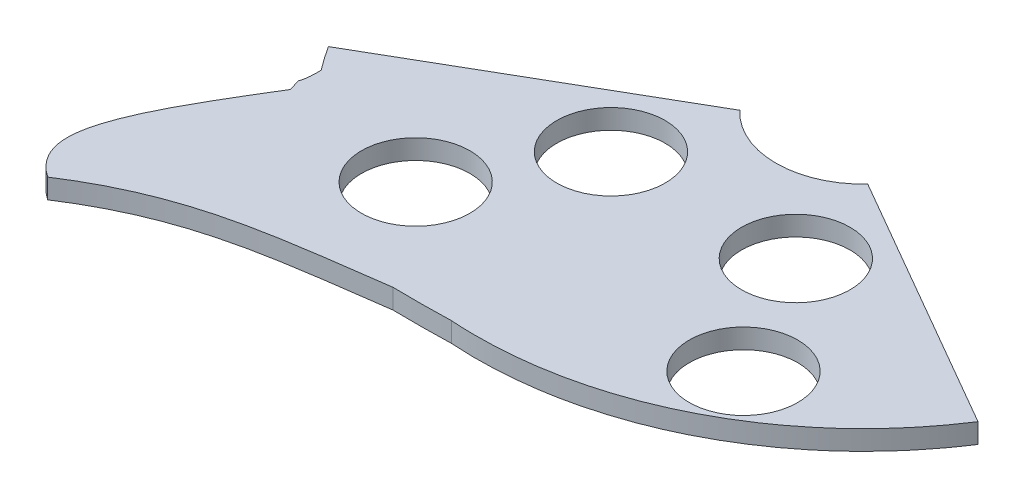
ISO-10303-21;
HEADER;
FILE_DESCRIPTION(('STEP AP214'),'2;1');
FILE_NAME('part.step','',(''),(''),'','','');
FILE_SCHEMA(('AUTOMOTIVE_DESIGN { 1 0 10303 214 1 1 1 1 }'));
ENDSEC;
DATA;
#1=APPLICATION_CONTEXT('core data for automotive mechanical design processes');
#2=APPLICATION_PROTOCOL_DEFINITION('international standard','automotive_design',2000,#1);
#3=PRODUCT_CONTEXT('',#1,'mechanical');
#4=PRODUCT('Part','Part','',(#3));
#5=PRODUCT_RELATED_PRODUCT_CATEGORY('part','',(#4));
#6=PRODUCT_DEFINITION_FORMATION('','',#4);
#7=PRODUCT_DEFINITION_CONTEXT('part definition',#1,'design');
#8=PRODUCT_DEFINITION('design','',#6,#7);
#9=PRODUCT_DEFINITION_SHAPE('','',#8);
#10=(LENGTH_UNIT() NAMED_UNIT(*) SI_UNIT(.MILLI.,.METRE.));
#11=(NAMED_UNIT(*) PLANE_ANGLE_UNIT() SI_UNIT($,.RADIAN.));
#12=(NAMED_UNIT(*) SI_UNIT($,.STERADIAN.) SOLID_ANGLE_UNIT());
#13=UNCERTAINTY_MEASURE_WITH_UNIT(LENGTH_MEASURE(1.E-05),#10,'distance_accuracy_value','');
#14=(GEOMETRIC_REPRESENTATION_CONTEXT(3) GLOBAL_UNCERTAINTY_ASSIGNED_CONTEXT((#13)) GLOBAL_UNIT_ASSIGNED_CONTEXT((#10,
#11,#12)) REPRESENTATION_CONTEXT('',''));
#15=CARTESIAN_POINT('',(0.,0.,0.));
#16=DIRECTION('',(0.,0.,1.));
#17=DIRECTION('',(1.,0.,0.));
#18=AXIS2_PLACEMENT_3D('',#15,#16,#17);
#19=CARTESIAN_POINT('',(-64.2384189790683,-115.736,45.1175481838721));
#20=DIRECTION('',(0.,-1.,0.));
#21=DIRECTION('',(0.,0.,-1.));
#22=AXIS2_PLACEMENT_3D('',#19,#20,#21);
#23=PLANE('',#22);
#24=CARTESIAN_POINT('',(18.75,-115.736,32.476));
#25=DIRECTION('',(0.,-1.,0.));
#26=DIRECTION('',(0.,0.,-1.));
#27=AXIS2_PLACEMENT_3D('',#24,#25,#26);
#28=CIRCLE('',#27,10.999845998306);
#29=CARTESIAN_POINT('',(18.75,-115.736,21.476154001694));
#30=VERTEX_POINT('',#29);
#31=EDGE_CURVE('E420',#30,#30,#28,.T.);
#32=ORIENTED_EDGE('',*,*,#31,.F.);
#33=EDGE_LOOP('',(#32));
#34=FACE_BOUND('',#33,.T.);
#35=CARTESIAN_POINT('',(-33.25,-115.736,57.591));
#36=DIRECTION('',(0.,-1.,0.));
#37=DIRECTION('',(0.,0.,-1.));
#38=AXIS2_PLACEMENT_3D('',#35,#36,#37);
#39=CIRCLE('',#38,10.999845998306);
#40=CARTESIAN_POINT('',(-33.25,-115.736,46.591154001694));
#41=VERTEX_POINT('',#40);
#42=EDGE_CURVE('E401',#41,#41,#39,.T.);
#43=ORIENTED_EDGE('',*,*,#42,.F.);
#44=EDGE_LOOP('',(#43));
#45=FACE_BOUND('',#44,.T.);
#46=CARTESIAN_POINT('',(-65.8942438215736,-115.736,42.6629141284689));
#47=CARTESIAN_POINT('',(-64.821215154821,-115.736,44.3196496713474));
#48=CARTESIAN_POINT('',(-63.6858197422078,-115.736,45.9368779830899));
#49=CARTESIAN_POINT('',(-62.4920033198862,-115.736,47.5078883791959));
#50=B_SPLINE_CURVE_WITH_KNOTS('',3,(#46,#47,#48,#49),.UNSPECIFIED.,.F.,.F.,(4,4),(0.,1.),.UNSPECIFIED.);
#51=CARTESIAN_POINT('',(-62.4920087226007,-115.736,47.5078813311855));
#52=VERTEX_POINT('',#51);
#53=CARTESIAN_POINT('',(-65.8942438215736,-115.736,42.6629141284689));
#54=VERTEX_POINT('',#53);
#55=EDGE_CURVE('E356',#52,#54,#50,.F.);
#56=ORIENTED_EDGE('',*,*,#55,.T.);
#57=DIRECTION('',(0.866025113443951,0.,-0.500000502884139));
#58=VECTOR('',#57,1.);
#59=CARTESIAN_POINT('',(-65.8942438215736,-115.736,42.6629141284689));
#60=LINE('',#59,#58);
#61=CARTESIAN_POINT('',(-12.9766531358799,-115.736,12.1108879302399));
#62=VERTEX_POINT('',#61);
#63=EDGE_CURVE('E106',#54,#62,#60,.T.);
#64=ORIENTED_EDGE('',*,*,#63,.T.);
#65=CARTESIAN_POINT('',(0.,-115.736,0.));
#66=DIRECTION('',(0.,1.,0.));
#67=DIRECTION('',(0.,0.,-1.));
#68=AXIS2_PLACEMENT_3D('',#65,#66,#67);
#69=CIRCLE('',#68,17.7501305084715);
#70=CARTESIAN_POINT('',(12.9766531358511,-115.736,12.1108879302707));
#71=VERTEX_POINT('',#70);
#72=EDGE_CURVE('E281',#62,#71,#69,.T.);
#73=ORIENTED_EDGE('',*,*,#72,.T.);
#74=DIRECTION('',(0.866025113442765,0.,0.500000502886192));
#75=VECTOR('',#74,1.);
#76=CARTESIAN_POINT('',(12.9766531358511,-115.736,12.1108879302707));
#77=LINE('',#76,#75);
#78=CARTESIAN_POINT('',(65.8946490574718,-115.736,42.6631480920524));
#79=VERTEX_POINT('',#78);
#80=EDGE_CURVE('E257',#71,#79,#77,.T.);
#81=ORIENTED_EDGE('',*,*,#80,.T.);
#82=CARTESIAN_POINT('',(-5.30157105968373,-115.736,78.3201624096817));
#83=CARTESIAN_POINT('',(-1.82976210946589,-115.736,78.5549543412929));
#84=CARTESIAN_POINT('',(1.65817243661211,-115.736,78.5591588637488));
#85=CARTESIAN_POINT('',(8.60157803139392,-115.736,78.1049998875758));
#86=CARTESIAN_POINT('',(12.0586771858785,-115.736,77.6458246969388));
#87=CARTESIAN_POINT('',(22.2930913219497,-115.736,75.589405193245));
#88=CARTESIAN_POINT('',(28.9312071168843,-115.736,73.3073675965458));
#89=CARTESIAN_POINT('',(36.7076892509816,-115.736,69.4100180936819));
#90=CARTESIAN_POINT('',(38.2383123448178,-115.736,68.5782689053583));
#91=CARTESIAN_POINT('',(41.2402409669198,-115.736,66.8167971331938));
#92=CARTESIAN_POINT('',(42.7107152072999,-115.736,65.8871818077033));
#93=CARTESIAN_POINT('',(47.024387865849,-115.736,62.9523697451704));
#94=CARTESIAN_POINT('',(49.7733936157504,-115.736,60.8021359837134));
#95=CARTESIAN_POINT('',(54.9579247935689,-115.736,56.1613288921758));
#96=CARTESIAN_POINT('',(57.3960906586187,-115.736,53.6675581586682));
#97=CARTESIAN_POINT('',(61.9183463676682,-115.736,48.3797049099718));
#98=CARTESIAN_POINT('',(64.0036525900674,-115.736,45.5841130933256));
#99=CARTESIAN_POINT('',(65.8946490574718,-115.736,42.6631480920524));
#100=B_SPLINE_CURVE_WITH_KNOTS('',3,(#82,#83,#84,#85,#86,#87,#88,#89,#90,#91,#92,#93,#94,#95,
#96,#97,#98,#99),.UNSPECIFIED.,.F.,.F.,(4,2,2,2,2,2,2,2,4),(0.,0.125,0.25,0.5,0.5625,0.625,0.75,
0.875,1.),.UNSPECIFIED.);
#101=CARTESIAN_POINT('',(-5.30157105968373,-115.736,78.3201624096817));
#102=VERTEX_POINT('',#101);
#103=EDGE_CURVE('E252',#79,#102,#100,.F.);
#104=ORIENTED_EDGE('',*,*,#103,.T.);
#105=CARTESIAN_POINT('',(-17.0321029203015,-115.736,78.3907831502155));
#106=CARTESIAN_POINT('',(-16.616551513293,-115.736,78.3999052279712));
#107=CARTESIAN_POINT('',(-15.7975225339925,-115.736,78.417881603182));
#108=CARTESIAN_POINT('',(-14.587068750747,-115.736,78.4325018860431));
#109=CARTESIAN_POINT('',(-13.4131053124775,-115.736,78.4390530927773));
#110=CARTESIAN_POINT('',(-12.2757467140993,-115.736,78.4378859794865));
#111=CARTESIAN_POINT('',(-10.5076959084288,-115.736,78.4260551945144));
#112=CARTESIAN_POINT('',(-8.18693748953659,-115.736,78.3869100892719));
#113=CARTESIAN_POINT('',(-6.23337965807007,-115.736,78.3417176002086));
#114=CARTESIAN_POINT('',(-5.30157917340343,-115.736,78.3201618609649));
#115=B_SPLINE_CURVE_WITH_KNOTS('',3,(#105,#106,#107,#108,#109,#110,#111,#112,#113,#114),
.UNSPECIFIED.,.F.,.F.,(4,1,1,1,1,1,1,4),(0.,0.106278773228751,0.209469607058113,
0.309523103743173,0.406456471363622,0.500282846789045,0.761609705143889,0.999929002806985),.UNSPECIFIED.);
#116=CARTESIAN_POINT('',(-17.0321029203015,-115.736,78.3907831502155));
#117=VERTEX_POINT('',#116);
#118=EDGE_CURVE('E304',#102,#117,#115,.F.);
#119=ORIENTED_EDGE('',*,*,#118,.T.);
#120=CARTESIAN_POINT('',(733.33459476129,-115.736,2970.77574568698));
#121=CARTESIAN_POINT('',(207.676769340688,-115.736,23.9239494111355));
#122=CARTESIAN_POINT('',(94.7374022454807,-115.736,63.101957985555));
#123=CARTESIAN_POINT('',(-22.3067813286172,-115.736,79.1208367140931));
#124=CARTESIAN_POINT('',(-24.9466058358453,-115.736,79.4827883313451));
#125=CARTESIAN_POINT('',(-27.5850447781871,-115.736,79.8498461703774));
#126=CARTESIAN_POINT('',(-31.0771515389624,-115.736,80.350972813729));
#127=CARTESIAN_POINT('',(-35.3529633655814,-115.736,81.0075249327084));
#128=CARTESIAN_POINT('',(-40.4328469270105,-115.736,81.9100144077995));
#129=CARTESIAN_POINT('',(-45.453054611884,-115.736,82.9821114452909));
#130=CARTESIAN_POINT('',(-50.4434283230132,-115.736,84.304042499892));
#131=CARTESIAN_POINT('',(-55.3485692574396,-115.736,85.9203519269918));
#132=CARTESIAN_POINT('',(-60.100213690399,-115.736,87.8323282964769));
#133=CARTESIAN_POINT('',(-64.7250110362029,-115.736,90.058439279993));
#134=CARTESIAN_POINT('',(-68.0813104856534,-115.736,91.9534929224668));
#135=CARTESIAN_POINT('',(-103.90586800981,-115.736,114.006599804448));
#136=CARTESIAN_POINT('',(-119.285602734402,-115.736,165.292911067435));
#137=CARTESIAN_POINT('',(-1767.88570232071,-115.736,-2378.12716583205));
#138=B_SPLINE_CURVE_WITH_KNOTS('',3,(#120,#121,#122,#123,#124,#125,#126,#127,#128,#129,#130,
#131,#132,#133,#134,#135,#136,#137),.UNSPECIFIED.,.F.,.F.,(4,1,1,1,1,1,1,1,1,1,1,1,1,1,1,4),
(-6.05888495319925,0.0465279520464134,0.093119702923042,0.139735027550764,0.186337054362384,
0.232892992042463,0.32484486303022,0.413308101023025,0.503576566295723,0.594121150041052,
0.684050973255195,0.774390389817141,0.862672682271962,0.953177556598973,0.976478911480191,
3.06994632083093),.UNSPECIFIED.);
#139=CARTESIAN_POINT('',(-71.4377576462986,-115.736,94.0504116435612));
#140=VERTEX_POINT('',#139);
#141=EDGE_CURVE('E301',#117,#140,#138,.T.);
#142=ORIENTED_EDGE('',*,*,#141,.T.);
#143=DIRECTION('',(-0.93859041932943,0.,0.345033367579144));
#144=VECTOR('',#143,1.);
#145=CARTESIAN_POINT('',(-71.4379465634365,-115.736,94.0504810910171));
#146=LINE('',#145,#144);
#147=CARTESIAN_POINT('',(-71.4379465634365,-115.736,94.0504810910171));
#148=VERTEX_POINT('',#147);
#149=EDGE_CURVE('E135',#140,#148,#146,.T.);
#150=ORIENTED_EDGE('',*,*,#149,.T.);
#151=CARTESIAN_POINT('',(-71.4379465634365,-115.736,94.0504810910171));
#152=CARTESIAN_POINT('',(-74.3765708212368,-115.736,92.046964491225));
#153=CARTESIAN_POINT('',(-80.1404934591238,-115.736,83.430224539585));
#154=CARTESIAN_POINT('',(-69.5615214596991,-115.736,66.0953197256209));
#155=CARTESIAN_POINT('',(-62.204643609337,-115.736,54.040199694022));
#156=CARTESIAN_POINT('',(-62.1994547169959,-115.736,54.0316970762982));
#157=CARTESIAN_POINT('',(-62.1942658246548,-115.736,54.0231944585743));
#158=B_SPLINE_CURVE_WITH_KNOTS('',3,(#151,#152,#153,#154,#155,#156,#157),.UNSPECIFIED.,.F.,.F.,
(4,1,2,4),(0.,0.304916287120541,0.999509749294804,1.),.UNSPECIFIED.);
#159=CARTESIAN_POINT('',(-62.1942658246548,-115.736,54.0231944585743));
#160=VERTEX_POINT('',#159);
#161=EDGE_CURVE('E128',#148,#160,#158,.T.);
#162=ORIENTED_EDGE('',*,*,#161,.T.);
#163=CARTESIAN_POINT('',(-62.9270814284827,-115.736,51.7658983333318));
#164=CARTESIAN_POINT('',(-62.8039982076521,-115.736,52.1375268151621));
#165=CARTESIAN_POINT('',(-62.555271771553,-115.736,52.8885125128689));
#166=CARTESIAN_POINT('',(-62.3154239316836,-115.736,53.642380982731));
#167=CARTESIAN_POINT('',(-62.1942658091893,-115.736,54.0231944536538));
#168=B_SPLINE_CURVE_WITH_KNOTS('',3,(#163,#164,#165,#166,#167),.UNSPECIFIED.,.F.,.F.,(4,1,4),
(-5.93550897320938E-09,0.494866325349948,1.00002445432335),.UNSPECIFIED.);
#169=CARTESIAN_POINT('',(-62.9270814284827,-115.736,51.7658983333318));
#170=VERTEX_POINT('',#169);
#171=EDGE_CURVE('E132',#160,#170,#168,.F.);
#172=ORIENTED_EDGE('',*,*,#171,.T.);
#173=CARTESIAN_POINT('',(-62.4920087226007,-115.736,47.5078813311855));
#174=CARTESIAN_POINT('',(-62.4861969080698,-115.736,47.6033124540218));
#175=CARTESIAN_POINT('',(-62.4743917000895,-115.736,47.7971562607841));
#176=CARTESIAN_POINT('',(-62.4655287049166,-115.736,48.0930433996235));
#177=CARTESIAN_POINT('',(-62.4625881572499,-115.736,48.3986275840947));
#178=CARTESIAN_POINT('',(-62.4660741071052,-115.736,48.7086491047319));
#179=CARTESIAN_POINT('',(-62.4750371361408,-115.736,49.0199638169147));
#180=CARTESIAN_POINT('',(-62.4941117039246,-115.736,49.4322477366974));
#181=CARTESIAN_POINT('',(-62.5294460918508,-115.736,49.9465044164776));
#182=CARTESIAN_POINT('',(-62.6057508319232,-115.736,50.5589446017072));
#183=CARTESIAN_POINT('',(-62.703010236046,-115.736,51.0105270178218));
#184=CARTESIAN_POINT('',(-62.7831828298959,-115.736,51.3065853112552));
#185=CARTESIAN_POINT('',(-62.8259596687784,-115.736,51.4539528571806));
#186=CARTESIAN_POINT('',(-62.8716638385306,-115.736,51.600585998641));
#187=CARTESIAN_POINT('',(-62.9059136128527,-115.736,51.7044186961872));
#188=CARTESIAN_POINT('',(-62.9248401091502,-115.736,51.759389534557));
#189=CARTESIAN_POINT('',(-62.9270810497419,-115.736,51.7658982079601));
#190=B_SPLINE_CURVE_WITH_KNOTS('',3,(#173,#174,#175,#176,#177,#178,#179,#180,#181,#182,#183,
#184,#185,#186,#187,#188,#189),.UNSPECIFIED.,.F.,.F.,(4,1,1,1,1,1,1,1,1,1,1,1,1,1,4),
(1.7096323789989E-06,0.066594317478587,0.135269245767325,0.206169071997378,0.279453784896667,
0.351220115559591,0.423099967943786,0.56693882082322,0.710193754255849,0.852621963580616,
0.888222963459872,0.923845683770085,0.959502859938166,0.995205045689001,1.),.UNSPECIFIED.);
#191=EDGE_CURVE('E51',#170,#52,#190,.F.);
#192=ORIENTED_EDGE('',*,*,#191,.T.);
#193=EDGE_LOOP('',(#56,#64,#73,#81,#104,#119,#142,#150,#162,#172,#192));
#194=FACE_BOUND('',#193,.T.);
#195=CARTESIAN_POINT('',(33.25,-115.736,57.591));
#196=DIRECTION('',(0.,-1.,0.));
#197=DIRECTION('',(0.,0.,-1.));
#198=AXIS2_PLACEMENT_3D('',#195,#196,#197);
#199=CIRCLE('',#198,10.999845998306);
#200=CARTESIAN_POINT('',(33.25,-115.736,46.591154001694));
#201=VERTEX_POINT('',#200);
#202=EDGE_CURVE('E408',#201,#201,#199,.T.);
#203=ORIENTED_EDGE('',*,*,#202,.F.);
#204=EDGE_LOOP('',(#203));
#205=FACE_BOUND('',#204,.T.);
#206=CARTESIAN_POINT('',(-18.75,-115.736,32.476));
#207=DIRECTION('',(0.,-1.,0.));
#208=DIRECTION('',(0.,0.,-1.));
#209=AXIS2_PLACEMENT_3D('',#206,#207,#208);
#210=CIRCLE('',#209,10.999845998306);
#211=CARTESIAN_POINT('',(-18.75,-115.736,21.476154001694));
#212=VERTEX_POINT('',#211);
#213=EDGE_CURVE('E426',#212,#212,#210,.T.);
#214=ORIENTED_EDGE('',*,*,#213,.F.);
#215=EDGE_LOOP('',(#214));
#216=FACE_BOUND('',#215,.T.);
#217=ADVANCED_FACE('F30',(#34,#45,#194,#205,#216),#23,.T.);
#218=CARTESIAN_POINT('',(-64.2384189790683,-111.736,45.1175481838721));
#219=DIRECTION('',(0.,-1.,0.));
#220=DIRECTION('',(0.,0.,-1.));
#221=AXIS2_PLACEMENT_3D('',#218,#219,#220);
#222=PLANE('',#221);
#223=CARTESIAN_POINT('',(18.75,-111.736,32.476));
#224=DIRECTION('',(0.,-1.,0.));
#225=DIRECTION('',(0.,0.,-1.));
#226=AXIS2_PLACEMENT_3D('',#223,#224,#225);
#227=CIRCLE('',#226,10.999845998306);
#228=CARTESIAN_POINT('',(18.75,-111.736,21.476154001694));
#229=VERTEX_POINT('',#228);
#230=EDGE_CURVE('E423',#229,#229,#227,.T.);
#231=ORIENTED_EDGE('',*,*,#230,.T.);
#232=EDGE_LOOP('',(#231));
#233=FACE_BOUND('',#232,.T.);
#234=CARTESIAN_POINT('',(-33.25,-111.736,57.591));
#235=DIRECTION('',(0.,-1.,0.));
#236=DIRECTION('',(0.,0.,-1.));
#237=AXIS2_PLACEMENT_3D('',#234,#235,#236);
#238=CIRCLE('',#237,10.999845998306);
#239=CARTESIAN_POINT('',(-33.25,-111.736,46.591154001694));
#240=VERTEX_POINT('',#239);
#241=EDGE_CURVE('E403',#240,#240,#238,.T.);
#242=ORIENTED_EDGE('',*,*,#241,.T.);
#243=EDGE_LOOP('',(#242));
#244=FACE_BOUND('',#243,.T.);
#245=CARTESIAN_POINT('',(-62.4920033198862,-111.736,47.5078883791959));
#246=CARTESIAN_POINT('',(-63.6858197422078,-111.736,45.9368779830899));
#247=CARTESIAN_POINT('',(-64.821215154821,-111.736,44.3196496713474));
#248=CARTESIAN_POINT('',(-65.8942438215736,-111.736,42.6629141284689));
#249=B_SPLINE_CURVE_WITH_KNOTS('',3,(#245,#246,#247,#248),.UNSPECIFIED.,.F.,.F.,(4,4),(0.,1.),.UNSPECIFIED.);
#250=CARTESIAN_POINT('',(-62.4920087226007,-111.736,47.5078813311855));
#251=VERTEX_POINT('',#250);
#252=CARTESIAN_POINT('',(-65.8942438215736,-111.736,42.6629141284689));
#253=VERTEX_POINT('',#252);
#254=EDGE_CURVE('E384',#251,#253,#249,.T.);
#255=ORIENTED_EDGE('',*,*,#254,.F.);
#256=CARTESIAN_POINT('',(-62.9270810497419,-111.736,51.7658982079601));
#257=CARTESIAN_POINT('',(-62.9248401091502,-111.736,51.759389534557));
#258=CARTESIAN_POINT('',(-62.9059136128527,-111.736,51.7044186961872));
#259=CARTESIAN_POINT('',(-62.8716638385306,-111.736,51.600585998641));
#260=CARTESIAN_POINT('',(-62.8259596687784,-111.736,51.4539528571806));
#261=CARTESIAN_POINT('',(-62.7831828298959,-111.736,51.3065853112552));
#262=CARTESIAN_POINT('',(-62.703010236046,-111.736,51.0105270178218));
#263=CARTESIAN_POINT('',(-62.6057508319232,-111.736,50.5589446017072));
#264=CARTESIAN_POINT('',(-62.5294460918508,-111.736,49.9465044164776));
#265=CARTESIAN_POINT('',(-62.4941117039246,-111.736,49.4322477366974));
#266=CARTESIAN_POINT('',(-62.4750371361408,-111.736,49.0199638169147));
#267=CARTESIAN_POINT('',(-62.4660741071052,-111.736,48.7086491047319));
#268=CARTESIAN_POINT('',(-62.4625881572499,-111.736,48.3986275840947));
#269=CARTESIAN_POINT('',(-62.4655287049166,-111.736,48.0930433996235));
#270=CARTESIAN_POINT('',(-62.4743917000895,-111.736,47.7971562607841));
#271=CARTESIAN_POINT('',(-62.4861969080698,-111.736,47.6033124540218));
#272=CARTESIAN_POINT('',(-62.4920087226007,-111.736,47.5078813311855));
#273=B_SPLINE_CURVE_WITH_KNOTS('',3,(#256,#257,#258,#259,#260,#261,#262,#263,#264,#265,#266,
#267,#268,#269,#270,#271,#272),.UNSPECIFIED.,.F.,.F.,(4,1,1,1,1,1,1,1,1,1,1,1,1,1,4),
(1.70963237893963E-06,0.00479666394337824,0.0404988496942132,0.0761560258622945,
0.111778746172507,0.147379746051763,0.28980795537653,0.433062888809159,0.576901741688593,
0.648781594072788,0.720547924735712,0.793832637635001,0.864732463865054,0.933407392153792,1.),.UNSPECIFIED.);
#274=CARTESIAN_POINT('',(-62.9270814284827,-111.736,51.7658983333318));
#275=VERTEX_POINT('',#274);
#276=EDGE_CURVE('E97',#275,#251,#273,.T.);
#277=ORIENTED_EDGE('',*,*,#276,.F.);
#278=CARTESIAN_POINT('',(-62.1942658091893,-111.736,54.0231944536538));
#279=CARTESIAN_POINT('',(-62.3154239316836,-111.736,53.642380982731));
#280=CARTESIAN_POINT('',(-62.555271771553,-111.736,52.8885125128689));
#281=CARTESIAN_POINT('',(-62.8039982076521,-111.736,52.1375268151621));
#282=CARTESIAN_POINT('',(-62.9270814284827,-111.736,51.7658983333318));
#283=B_SPLINE_CURVE_WITH_KNOTS('',3,(#278,#279,#280,#281,#282),.UNSPECIFIED.,.F.,.F.,(4,1,4),
(-5.93550902682911E-09,0.505158123037892,1.00002445432335),.UNSPECIFIED.);
#284=CARTESIAN_POINT('',(-62.1942658246548,-111.736,54.0231944585743));
#285=VERTEX_POINT('',#284);
#286=EDGE_CURVE('E90',#285,#275,#283,.T.);
#287=ORIENTED_EDGE('',*,*,#286,.F.);
#288=CARTESIAN_POINT('',(-71.4379465634365,-111.736,94.0504810910171));
#289=CARTESIAN_POINT('',(-74.3765708212368,-111.736,92.046964491225));
#290=CARTESIAN_POINT('',(-80.1404934591238,-111.736,83.430224539585));
#291=CARTESIAN_POINT('',(-69.5615214596991,-111.736,66.0953197256209));
#292=CARTESIAN_POINT('',(-62.204643609337,-111.736,54.040199694022));
#293=CARTESIAN_POINT('',(-62.1994547169959,-111.736,54.0316970762982));
#294=CARTESIAN_POINT('',(-62.1942658246548,-111.736,54.0231944585743));
#295=B_SPLINE_CURVE_WITH_KNOTS('',3,(#288,#289,#290,#291,#292,#293,#294),.UNSPECIFIED.,.F.,.F.,
(4,1,2,4),(0.,0.304916287120541,0.999509749294804,1.),.UNSPECIFIED.);
#296=CARTESIAN_POINT('',(-71.4379465634365,-111.736,94.0504810910171));
#297=VERTEX_POINT('',#296);
#298=EDGE_CURVE('E143',#297,#285,#295,.T.);
#299=ORIENTED_EDGE('',*,*,#298,.F.);
#300=DIRECTION('',(-0.93859041932943,0.,0.345033367579144));
#301=VECTOR('',#300,1.);
#302=CARTESIAN_POINT('',(-71.4379465634365,-111.736,94.0504810910171));
#303=LINE('',#302,#301);
#304=CARTESIAN_POINT('',(-71.4377576462986,-111.736,94.0504116435612));
#305=VERTEX_POINT('',#304);
#306=EDGE_CURVE('E195',#305,#297,#303,.T.);
#307=ORIENTED_EDGE('',*,*,#306,.F.);
#308=CARTESIAN_POINT('',(733.33459476129,-111.736,2970.77574568698));
#309=CARTESIAN_POINT('',(207.676769340688,-111.736,23.9239494111355));
#310=CARTESIAN_POINT('',(94.7374022454807,-111.736,63.101957985555));
#311=CARTESIAN_POINT('',(-22.3067813286172,-111.736,79.1208367140931));
#312=CARTESIAN_POINT('',(-24.9466058358453,-111.736,79.4827883313451));
#313=CARTESIAN_POINT('',(-27.5850447781871,-111.736,79.8498461703774));
#314=CARTESIAN_POINT('',(-31.0771515389624,-111.736,80.350972813729));
#315=CARTESIAN_POINT('',(-35.3529633655814,-111.736,81.0075249327084));
#316=CARTESIAN_POINT('',(-40.4328469270105,-111.736,81.9100144077995));
#317=CARTESIAN_POINT('',(-45.453054611884,-111.736,82.9821114452909));
#318=CARTESIAN_POINT('',(-50.4434283230132,-111.736,84.304042499892));
#319=CARTESIAN_POINT('',(-55.3485692574396,-111.736,85.9203519269918));
#320=CARTESIAN_POINT('',(-60.100213690399,-111.736,87.8323282964769));
#321=CARTESIAN_POINT('',(-64.7250110362029,-111.736,90.058439279993));
#322=CARTESIAN_POINT('',(-68.0813104856534,-111.736,91.9534929224668));
#323=CARTESIAN_POINT('',(-103.90586800981,-111.736,114.006599804448));
#324=CARTESIAN_POINT('',(-119.285602734402,-111.736,165.292911067435));
#325=CARTESIAN_POINT('',(-1767.88570232071,-111.736,-2378.12716583205));
#326=B_SPLINE_CURVE_WITH_KNOTS('',3,(#308,#309,#310,#311,#312,#313,#314,#315,#316,#317,#318,
#319,#320,#321,#322,#323,#324,#325),.UNSPECIFIED.,.F.,.F.,(4,1,1,1,1,1,1,1,1,1,1,1,1,1,1,4),
(-6.05888495319925,0.0465279520464134,0.093119702923042,0.139735027550764,0.186337054362384,
0.232892992042463,0.32484486303022,0.413308101023025,0.503576566295723,0.594121150041052,
0.684050973255195,0.774390389817141,0.862672682271962,0.953177556598973,0.976478911480191,
3.06994632083093),.UNSPECIFIED.);
#327=CARTESIAN_POINT('',(-17.0321029203015,-111.736,78.3907831502155));
#328=VERTEX_POINT('',#327);
#329=EDGE_CURVE('E197',#328,#305,#326,.T.);
#330=ORIENTED_EDGE('',*,*,#329,.F.);
#331=CARTESIAN_POINT('',(-5.30157917340343,-111.736,78.3201618609649));
#332=CARTESIAN_POINT('',(-6.23337965807007,-111.736,78.3417176002086));
#333=CARTESIAN_POINT('',(-8.18693748953659,-111.736,78.3869100892719));
#334=CARTESIAN_POINT('',(-10.5076959084288,-111.736,78.4260551945144));
#335=CARTESIAN_POINT('',(-12.2757467140993,-111.736,78.4378859794865));
#336=CARTESIAN_POINT('',(-13.4131053124775,-111.736,78.4390530927773));
#337=CARTESIAN_POINT('',(-14.587068750747,-111.736,78.4325018860431));
#338=CARTESIAN_POINT('',(-15.7975225339925,-111.736,78.417881603182));
#339=CARTESIAN_POINT('',(-16.616551513293,-111.736,78.3999052279712));
#340=CARTESIAN_POINT('',(-17.0321029203015,-111.736,78.3907831502155));
#341=B_SPLINE_CURVE_WITH_KNOTS('',3,(#331,#332,#333,#334,#335,#336,#337,#338,#339,#340),
.UNSPECIFIED.,.F.,.F.,(4,1,1,1,1,1,1,4),(0.,0.238319297663096,0.49964615601794,
0.593472531443363,0.690405899063812,0.790459395748872,0.893650229578234,0.999929002806985),.UNSPECIFIED.);
#342=CARTESIAN_POINT('',(-5.30157105968373,-111.736,78.3201624096817));
#343=VERTEX_POINT('',#342);
#344=EDGE_CURVE('E312',#343,#328,#341,.T.);
#345=ORIENTED_EDGE('',*,*,#344,.F.);
#346=CARTESIAN_POINT('',(65.8946490574718,-111.736,42.6631480920524));
#347=CARTESIAN_POINT('',(64.0036525900674,-111.736,45.5841130933256));
#348=CARTESIAN_POINT('',(61.9183463676682,-111.736,48.3797049099718));
#349=CARTESIAN_POINT('',(57.3960906586187,-111.736,53.6675581586682));
#350=CARTESIAN_POINT('',(54.9579247935689,-111.736,56.1613288921758));
#351=CARTESIAN_POINT('',(49.7733936157504,-111.736,60.8021359837134));
#352=CARTESIAN_POINT('',(47.024387865849,-111.736,62.9523697451704));
#353=CARTESIAN_POINT('',(42.7107152072999,-111.736,65.8871818077033));
#354=CARTESIAN_POINT('',(41.2402409669198,-111.736,66.8167971331938));
#355=CARTESIAN_POINT('',(38.2383123448178,-111.736,68.5782689053583));
#356=CARTESIAN_POINT('',(36.7076892509816,-111.736,69.4100180936819));
#357=CARTESIAN_POINT('',(28.9312071168843,-111.736,73.3073675965458));
#358=CARTESIAN_POINT('',(22.2930913219497,-111.736,75.589405193245));
#359=CARTESIAN_POINT('',(12.0586771858785,-111.736,77.6458246969388));
#360=CARTESIAN_POINT('',(8.60157803139392,-111.736,78.1049998875758));
#361=CARTESIAN_POINT('',(1.65817243661211,-111.736,78.5591588637488));
#362=CARTESIAN_POINT('',(-1.82976210946589,-111.736,78.5549543412929));
#363=CARTESIAN_POINT('',(-5.30157105968373,-111.736,78.3201624096817));
#364=B_SPLINE_CURVE_WITH_KNOTS('',3,(#346,#347,#348,#349,#350,#351,#352,#353,#354,#355,#356,
#357,#358,#359,#360,#361,#362,#363),.UNSPECIFIED.,.F.,.F.,(4,2,2,2,2,2,2,2,4),(0.,0.125,0.25,
0.375,0.4375,0.5,0.75,0.875,1.),.UNSPECIFIED.);
#365=CARTESIAN_POINT('',(65.8946490574718,-111.736,42.6631480920524));
#366=VERTEX_POINT('',#365);
#367=EDGE_CURVE('E342',#366,#343,#364,.T.);
#368=ORIENTED_EDGE('',*,*,#367,.F.);
#369=DIRECTION('',(0.866025113442765,0.,0.500000502886192));
#370=VECTOR('',#369,1.);
#371=CARTESIAN_POINT('',(12.9766531358511,-111.736,12.1108879302707));
#372=LINE('',#371,#370);
#373=CARTESIAN_POINT('',(12.9766531358511,-111.736,12.1108879302707));
#374=VERTEX_POINT('',#373);
#375=EDGE_CURVE('E193',#374,#366,#372,.T.);
#376=ORIENTED_EDGE('',*,*,#375,.F.);
#377=CARTESIAN_POINT('',(0.,-111.736,0.));
#378=DIRECTION('',(0.,1.,0.));
#379=DIRECTION('',(0.,0.,-1.));
#380=AXIS2_PLACEMENT_3D('',#377,#378,#379);
#381=CIRCLE('',#380,17.7501305084715);
#382=CARTESIAN_POINT('',(-12.9766531358799,-111.736,12.1108879302399));
#383=VERTEX_POINT('',#382);
#384=EDGE_CURVE('E188',#383,#374,#381,.T.);
#385=ORIENTED_EDGE('',*,*,#384,.F.);
#386=DIRECTION('',(0.866025113443951,0.,-0.500000502884139));
#387=VECTOR('',#386,1.);
#388=CARTESIAN_POINT('',(-65.8942438215736,-111.736,42.6629141284689));
#389=LINE('',#388,#387);
#390=EDGE_CURVE('E194',#253,#383,#389,.T.);
#391=ORIENTED_EDGE('',*,*,#390,.F.);
#392=EDGE_LOOP('',(#255,#277,#287,#299,#307,#330,#345,#368,#376,#385,#391));
#393=FACE_BOUND('',#392,.T.);
#394=CARTESIAN_POINT('',(33.25,-111.736,57.591));
#395=DIRECTION('',(0.,-1.,0.));
#396=DIRECTION('',(0.,0.,-1.));
#397=AXIS2_PLACEMENT_3D('',#394,#395,#396);
#398=CIRCLE('',#397,10.999845998306);
#399=CARTESIAN_POINT('',(33.25,-111.736,46.591154001694));
#400=VERTEX_POINT('',#399);
#401=EDGE_CURVE('E411',#400,#400,#398,.T.);
#402=ORIENTED_EDGE('',*,*,#401,.T.);
#403=EDGE_LOOP('',(#402));
#404=FACE_BOUND('',#403,.T.);
#405=CARTESIAN_POINT('',(-18.75,-111.736,32.476));
#406=DIRECTION('',(0.,-1.,0.));
#407=DIRECTION('',(0.,0.,-1.));
#408=AXIS2_PLACEMENT_3D('',#405,#406,#407);
#409=CIRCLE('',#408,10.999845998306);
#410=CARTESIAN_POINT('',(-18.75,-111.736,21.476154001694));
#411=VERTEX_POINT('',#410);
#412=EDGE_CURVE('E429',#411,#411,#409,.T.);
#413=ORIENTED_EDGE('',*,*,#412,.T.);
#414=EDGE_LOOP('',(#413));
#415=FACE_BOUND('',#414,.T.);
#416=ADVANCED_FACE('F221',(#233,#244,#393,#404,#415),#222,.F.);
#417=CARTESIAN_POINT('',(-62.4920033198862,-115.736,47.5078883791959));
#418=CARTESIAN_POINT('',(-63.6858197422078,-115.736,45.9368779830899));
#419=CARTESIAN_POINT('',(-64.821215154821,-115.736,44.3196496713474));
#420=CARTESIAN_POINT('',(-65.8942438215736,-115.736,42.6629141284689));
#421=B_SPLINE_CURVE_WITH_KNOTS('',3,(#417,#418,#419,#420),.UNSPECIFIED.,.F.,.F.,(4,4),(0.,1.),.UNSPECIFIED.);
#422=DIRECTION('',(0.,1.,0.));
#423=VECTOR('',#422,1.);
#424=SURFACE_OF_LINEAR_EXTRUSION('',#421,#423);
#425=ORIENTED_EDGE('',*,*,#254,.T.);
#426=DIRECTION('',(0.,1.,0.));
#427=VECTOR('',#426,1.);
#428=CARTESIAN_POINT('',(-65.8942438215736,-115.736,42.6629141284689));
#429=LINE('',#428,#427);
#430=EDGE_CURVE('E11',#54,#253,#429,.T.);
#431=ORIENTED_EDGE('',*,*,#430,.F.);
#432=ORIENTED_EDGE('',*,*,#55,.F.);
#433=DIRECTION('',(0.,1.,0.));
#434=VECTOR('',#433,1.);
#435=CARTESIAN_POINT('',(-62.4920087226007,-115.736,47.5078813311855));
#436=LINE('',#435,#434);
#437=EDGE_CURVE('E654',#52,#251,#436,.T.);
#438=ORIENTED_EDGE('',*,*,#437,.T.);
#439=EDGE_LOOP('',(#425,#431,#432,#438));
#440=FACE_BOUND('',#439,.T.);
#441=ADVANCED_FACE('F32',(#440),#424,.F.);
#442=CARTESIAN_POINT('',(-65.8942438215736,-115.736,42.6629141284689));
#443=DIRECTION('',(0.500000502884139,0.,0.866025113443951));
#444=DIRECTION('',(0.866025113443951,0.,-0.500000502884139));
#445=AXIS2_PLACEMENT_3D('',#442,#443,#444);
#446=PLANE('',#445);
#447=ORIENTED_EDGE('',*,*,#390,.T.);
#448=DIRECTION('',(0.,1.,0.));
#449=VECTOR('',#448,1.);
#450=CARTESIAN_POINT('',(-12.9766531358799,-115.736,12.1108879302399));
#451=LINE('',#450,#449);
#452=EDGE_CURVE('E42',#62,#383,#451,.T.);
#453=ORIENTED_EDGE('',*,*,#452,.F.);
#454=ORIENTED_EDGE('',*,*,#63,.F.);
#455=ORIENTED_EDGE('',*,*,#430,.T.);
#456=EDGE_LOOP('',(#447,#453,#454,#455));
#457=FACE_BOUND('',#456,.T.);
#458=ADVANCED_FACE('F448',(#457),#446,.F.);
#459=CARTESIAN_POINT('',(0.,-115.736,0.));
#460=DIRECTION('',(0.,1.,0.));
#461=DIRECTION('',(0.,0.,1.));
#462=AXIS2_PLACEMENT_3D('',#459,#460,#461);
#463=CYLINDRICAL_SURFACE('',#462,17.7501305084715);
#464=ORIENTED_EDGE('',*,*,#384,.T.);
#465=DIRECTION('',(0.,1.,0.));
#466=VECTOR('',#465,1.);
#467=CARTESIAN_POINT('',(12.9766531358511,-115.736,12.1108879302707));
#468=LINE('',#467,#466);
#469=EDGE_CURVE('E203',#71,#374,#468,.T.);
#470=ORIENTED_EDGE('',*,*,#469,.F.);
#471=ORIENTED_EDGE('',*,*,#72,.F.);
#472=ORIENTED_EDGE('',*,*,#452,.T.);
#473=EDGE_LOOP('',(#464,#470,#471,#472));
#474=FACE_BOUND('',#473,.T.);
#475=ADVANCED_FACE('F514',(#474),#463,.F.);
#476=CARTESIAN_POINT('',(12.9766531358511,-115.736,12.1108879302707));
#477=DIRECTION('',(-0.500000502886192,0.,0.866025113442765));
#478=DIRECTION('',(0.866025113442765,0.,0.500000502886192));
#479=AXIS2_PLACEMENT_3D('',#476,#477,#478);
#480=PLANE('',#479);
#481=ORIENTED_EDGE('',*,*,#375,.T.);
#482=DIRECTION('',(0.,1.,0.));
#483=VECTOR('',#482,1.);
#484=CARTESIAN_POINT('',(65.8946490574718,-115.736,42.6631480920524));
#485=LINE('',#484,#483);
#486=EDGE_CURVE('E206',#79,#366,#485,.T.);
#487=ORIENTED_EDGE('',*,*,#486,.F.);
#488=ORIENTED_EDGE('',*,*,#80,.F.);
#489=ORIENTED_EDGE('',*,*,#469,.T.);
#490=EDGE_LOOP('',(#481,#487,#488,#489));
#491=FACE_BOUND('',#490,.T.);
#492=ADVANCED_FACE('F271',(#491),#480,.F.);
#493=CARTESIAN_POINT('',(65.8946490574718,-115.736,42.6631480920524));
#494=CARTESIAN_POINT('',(64.0036525900674,-115.736,45.5841130933256));
#495=CARTESIAN_POINT('',(61.9183463676682,-115.736,48.3797049099718));
#496=CARTESIAN_POINT('',(57.3960906586187,-115.736,53.6675581586682));
#497=CARTESIAN_POINT('',(54.9579247935689,-115.736,56.1613288921758));
#498=CARTESIAN_POINT('',(49.7733936157504,-115.736,60.8021359837134));
#499=CARTESIAN_POINT('',(47.024387865849,-115.736,62.9523697451704));
#500=CARTESIAN_POINT('',(42.7107152072999,-115.736,65.8871818077033));
#501=CARTESIAN_POINT('',(41.2402409669198,-115.736,66.8167971331938));
#502=CARTESIAN_POINT('',(38.2383123448178,-115.736,68.5782689053583));
#503=CARTESIAN_POINT('',(36.7076892509816,-115.736,69.4100180936819));
#504=CARTESIAN_POINT('',(28.9312071168843,-115.736,73.3073675965458));
#505=CARTESIAN_POINT('',(22.2930913219497,-115.736,75.589405193245));
#506=CARTESIAN_POINT('',(12.0586771858785,-115.736,77.6458246969388));
#507=CARTESIAN_POINT('',(8.60157803139392,-115.736,78.1049998875758));
#508=CARTESIAN_POINT('',(1.65817243661211,-115.736,78.5591588637488));
#509=CARTESIAN_POINT('',(-1.82976210946589,-115.736,78.5549543412929));
#510=CARTESIAN_POINT('',(-5.30157105968373,-115.736,78.3201624096817));
#511=B_SPLINE_CURVE_WITH_KNOTS('',3,(#493,#494,#495,#496,#497,#498,#499,#500,#501,#502,#503,
#504,#505,#506,#507,#508,#509,#510),.UNSPECIFIED.,.F.,.F.,(4,2,2,2,2,2,2,2,4),(0.,0.125,0.25,
0.375,0.4375,0.5,0.75,0.875,1.),.UNSPECIFIED.);
#512=DIRECTION('',(0.,1.,0.));
#513=VECTOR('',#512,1.);
#514=SURFACE_OF_LINEAR_EXTRUSION('',#511,#513);
#515=ORIENTED_EDGE('',*,*,#367,.T.);
#516=DIRECTION('',(0.,1.,0.));
#517=VECTOR('',#516,1.);
#518=CARTESIAN_POINT('',(-5.30157105968373,-115.736,78.3201624096817));
#519=LINE('',#518,#517);
#520=EDGE_CURVE('E591',#102,#343,#519,.T.);
#521=ORIENTED_EDGE('',*,*,#520,.F.);
#522=ORIENTED_EDGE('',*,*,#103,.F.);
#523=ORIENTED_EDGE('',*,*,#486,.T.);
#524=EDGE_LOOP('',(#515,#521,#522,#523));
#525=FACE_BOUND('',#524,.T.);
#526=ADVANCED_FACE('F259',(#525),#514,.F.);
#527=CARTESIAN_POINT('',(-5.30157917340343,-115.736,78.3201618609649));
#528=CARTESIAN_POINT('',(-6.23337965807007,-115.736,78.3417176002086));
#529=CARTESIAN_POINT('',(-8.18693748953659,-115.736,78.3869100892719));
#530=CARTESIAN_POINT('',(-10.5076959084288,-115.736,78.4260551945144));
#531=CARTESIAN_POINT('',(-12.2757467140993,-115.736,78.4378859794865));
#532=CARTESIAN_POINT('',(-13.4131053124775,-115.736,78.4390530927773));
#533=CARTESIAN_POINT('',(-14.587068750747,-115.736,78.4325018860431));
#534=CARTESIAN_POINT('',(-15.7978001831238,-115.736,78.417878249639));
#535=CARTESIAN_POINT('',(-16.6171067132345,-115.736,78.3998930412922));
#536=CARTESIAN_POINT('',(-17.0329357201886,-115.736,78.3907648688051));
#537=B_SPLINE_CURVE_WITH_KNOTS('',3,(#527,#528,#529,#530,#531,#532,#533,#534,#535,#536),
.UNSPECIFIED.,.F.,.F.,(4,1,1,1,1,1,1,4),(0.,0.238319297663096,0.49964615601794,
0.593472531443363,0.690405899063812,0.790459395748872,0.893650229578234,1.),.UNSPECIFIED.);
#538=DIRECTION('',(0.,1.,0.));
#539=VECTOR('',#538,1.);
#540=SURFACE_OF_LINEAR_EXTRUSION('',#537,#539);
#541=ORIENTED_EDGE('',*,*,#344,.T.);
#542=DIRECTION('',(0.,1.,0.));
#543=VECTOR('',#542,1.);
#544=CARTESIAN_POINT('',(-17.0321029203015,-115.736,78.3907831502155));
#545=LINE('',#544,#543);
#546=EDGE_CURVE('E202',#117,#328,#545,.T.);
#547=ORIENTED_EDGE('',*,*,#546,.F.);
#548=ORIENTED_EDGE('',*,*,#118,.F.);
#549=ORIENTED_EDGE('',*,*,#520,.T.);
#550=EDGE_LOOP('',(#541,#547,#548,#549));
#551=FACE_BOUND('',#550,.T.);
#552=ADVANCED_FACE('F270',(#551),#540,.F.);
#553=DIRECTION('',(0.,1.,0.));
#554=VECTOR('',#553,1.);
#555=SURFACE_OF_LINEAR_EXTRUSION('',#138,#554);
#556=ORIENTED_EDGE('',*,*,#329,.T.);
#557=DIRECTION('',(0.,1.,0.));
#558=VECTOR('',#557,1.);
#559=CARTESIAN_POINT('',(-71.4377576462986,-115.736,94.0504116435612));
#560=LINE('',#559,#558);
#561=EDGE_CURVE('E199',#140,#305,#560,.T.);
#562=ORIENTED_EDGE('',*,*,#561,.F.);
#563=ORIENTED_EDGE('',*,*,#141,.F.);
#564=ORIENTED_EDGE('',*,*,#546,.T.);
#565=EDGE_LOOP('',(#556,#562,#563,#564));
#566=FACE_BOUND('',#565,.T.);
#567=ADVANCED_FACE('F299',(#566),#555,.F.);
#568=CARTESIAN_POINT('',(-71.4379465634365,-115.736,94.0504810910171));
#569=DIRECTION('',(-0.345033367579144,0.,-0.93859041932943));
#570=DIRECTION('',(-0.93859041932943,0.,0.345033367579144));
#571=AXIS2_PLACEMENT_3D('',#568,#569,#570);
#572=PLANE('',#571);
#573=ORIENTED_EDGE('',*,*,#306,.T.);
#574=DIRECTION('',(0.,1.,0.));
#575=VECTOR('',#574,1.);
#576=CARTESIAN_POINT('',(-71.4379465634365,-115.736,94.0504810910171));
#577=LINE('',#576,#575);
#578=EDGE_CURVE('E144',#148,#297,#577,.T.);
#579=ORIENTED_EDGE('',*,*,#578,.F.);
#580=ORIENTED_EDGE('',*,*,#149,.F.);
#581=ORIENTED_EDGE('',*,*,#561,.T.);
#582=EDGE_LOOP('',(#573,#579,#580,#581));
#583=FACE_BOUND('',#582,.T.);
#584=ADVANCED_FACE('F483',(#583),#572,.F.);
#585=DIRECTION('',(0.,1.,0.));
#586=VECTOR('',#585,1.);
#587=SURFACE_OF_LINEAR_EXTRUSION('',#158,#586);
#588=ORIENTED_EDGE('',*,*,#298,.T.);
#589=DIRECTION('',(0.,1.,0.));
#590=VECTOR('',#589,1.);
#591=CARTESIAN_POINT('',(-62.1942658246548,-115.736,54.0231944585743));
#592=LINE('',#591,#590);
#593=EDGE_CURVE('E140',#160,#285,#592,.T.);
#594=ORIENTED_EDGE('',*,*,#593,.F.);
#595=ORIENTED_EDGE('',*,*,#161,.F.);
#596=ORIENTED_EDGE('',*,*,#578,.T.);
#597=EDGE_LOOP('',(#588,#594,#595,#596));
#598=FACE_BOUND('',#597,.T.);
#599=ADVANCED_FACE('F141',(#598),#587,.F.);
#600=CARTESIAN_POINT('',(2826.84165138417,-115.736,-747.948647843583));
#601=CARTESIAN_POINT('',(-62.557906522888,-115.736,144.429754987983));
#602=CARTESIAN_POINT('',(-35.7625128281639,-115.736,44.4999931519547));
#603=CARTESIAN_POINT('',(-115.783182253508,-115.736,-20.7478927976906));
#604=CARTESIAN_POINT('',(2746.48615443096,-115.736,-995.547066515853));
#605=B_SPLINE_CURVE_WITH_KNOTS('',3,(#600,#601,#602,#603,#604),.UNSPECIFIED.,.F.,.F.,(4,1,4),
(-54.5305080823756,0.505158123037892,55.1568947489711),.UNSPECIFIED.);
#606=DIRECTION('',(0.,1.,0.));
#607=VECTOR('',#606,1.);
#608=SURFACE_OF_LINEAR_EXTRUSION('',#605,#607);
#609=ORIENTED_EDGE('',*,*,#286,.T.);
#610=DIRECTION('',(0.,1.,0.));
#611=VECTOR('',#610,1.);
#612=CARTESIAN_POINT('',(-62.9270814284827,-115.736,51.7658983333318));
#613=LINE('',#612,#611);
#614=EDGE_CURVE('E145',#170,#275,#613,.T.);
#615=ORIENTED_EDGE('',*,*,#614,.F.);
#616=ORIENTED_EDGE('',*,*,#171,.F.);
#617=ORIENTED_EDGE('',*,*,#593,.T.);
#618=EDGE_LOOP('',(#609,#615,#616,#617));
#619=FACE_BOUND('',#618,.T.);
#620=ADVANCED_FACE('F148',(#619),#608,.F.);
#621=CARTESIAN_POINT('',(-62.9270810497419,-115.736,51.7658982079601));
#622=CARTESIAN_POINT('',(-62.9248401091502,-115.736,51.759389534557));
#623=CARTESIAN_POINT('',(-62.9059136128527,-115.736,51.7044186961872));
#624=CARTESIAN_POINT('',(-62.8716638385306,-115.736,51.600585998641));
#625=CARTESIAN_POINT('',(-62.8259596687784,-115.736,51.4539528571806));
#626=CARTESIAN_POINT('',(-62.7831828298959,-115.736,51.3065853112552));
#627=CARTESIAN_POINT('',(-62.703010236046,-115.736,51.0105270178218));
#628=CARTESIAN_POINT('',(-62.6057508319232,-115.736,50.5589446017072));
#629=CARTESIAN_POINT('',(-62.5294460918508,-115.736,49.9465044164776));
#630=CARTESIAN_POINT('',(-62.4941117039246,-115.736,49.4322477366974));
#631=CARTESIAN_POINT('',(-62.4750371361408,-115.736,49.0199638169147));
#632=CARTESIAN_POINT('',(-62.4660741071052,-115.736,48.7086491047319));
#633=CARTESIAN_POINT('',(-62.4625881572499,-115.736,48.3986275840947));
#634=CARTESIAN_POINT('',(-62.4655287049166,-115.736,48.0930433996235));
#635=CARTESIAN_POINT('',(-62.4743917000895,-115.736,47.7971562607841));
#636=CARTESIAN_POINT('',(-62.4861969080698,-115.736,47.6033124540218));
#637=CARTESIAN_POINT('',(-62.4920087226007,-115.736,47.5078813311855));
#638=B_SPLINE_CURVE_WITH_KNOTS('',3,(#621,#622,#623,#624,#625,#626,#627,#628,#629,#630,#631,
#632,#633,#634,#635,#636,#637),.UNSPECIFIED.,.F.,.F.,(4,1,1,1,1,1,1,1,1,1,1,1,1,1,4),
(1.70963237893963E-06,0.00479666394337824,0.0404988496942132,0.0761560258622945,
0.111778746172507,0.147379746051763,0.28980795537653,0.433062888809159,0.576901741688593,
0.648781594072788,0.720547924735712,0.793832637635001,0.864732463865054,0.933407392153792,1.),.UNSPECIFIED.);
#639=DIRECTION('',(0.,1.,0.));
#640=VECTOR('',#639,1.);
#641=SURFACE_OF_LINEAR_EXTRUSION('',#638,#640);
#642=ORIENTED_EDGE('',*,*,#276,.T.);
#643=ORIENTED_EDGE('',*,*,#437,.F.);
#644=ORIENTED_EDGE('',*,*,#191,.F.);
#645=ORIENTED_EDGE('',*,*,#614,.T.);
#646=EDGE_LOOP('',(#642,#643,#644,#645));
#647=FACE_BOUND('',#646,.T.);
#648=ADVANCED_FACE('F168',(#647),#641,.F.);
#649=CARTESIAN_POINT('',(-33.25,-115.736,57.591));
#650=DIRECTION('',(0.,1.,0.));
#651=DIRECTION('',(0.,0.,1.));
#652=AXIS2_PLACEMENT_3D('',#649,#650,#651);
#653=CYLINDRICAL_SURFACE('',#652,10.999845998306);
#654=ORIENTED_EDGE('',*,*,#42,.T.);
#655=EDGE_LOOP('',(#654));
#656=FACE_BOUND('',#655,.T.);
#657=ORIENTED_EDGE('',*,*,#241,.F.);
#658=EDGE_LOOP('',(#657));
#659=FACE_BOUND('',#658,.T.);
#660=ADVANCED_FACE('F223',(#656,#659),#653,.F.);
#661=CARTESIAN_POINT('',(33.25,-115.736,57.591));
#662=DIRECTION('',(0.,1.,0.));
#663=DIRECTION('',(0.,0.,1.));
#664=AXIS2_PLACEMENT_3D('',#661,#662,#663);
#665=CYLINDRICAL_SURFACE('',#664,10.999845998306);
#666=ORIENTED_EDGE('',*,*,#202,.T.);
#667=EDGE_LOOP('',(#666));
#668=FACE_BOUND('',#667,.T.);
#669=ORIENTED_EDGE('',*,*,#401,.F.);
#670=EDGE_LOOP('',(#669));
#671=FACE_BOUND('',#670,.T.);
#672=ADVANCED_FACE('F455',(#668,#671),#665,.F.);
#673=CARTESIAN_POINT('',(18.75,-115.736,32.476));
#674=DIRECTION('',(0.,1.,0.));
#675=DIRECTION('',(0.,0.,1.));
#676=AXIS2_PLACEMENT_3D('',#673,#674,#675);
#677=CYLINDRICAL_SURFACE('',#676,10.999845998306);
#678=ORIENTED_EDGE('',*,*,#31,.T.);
#679=EDGE_LOOP('',(#678));
#680=FACE_BOUND('',#679,.T.);
#681=ORIENTED_EDGE('',*,*,#230,.F.);
#682=EDGE_LOOP('',(#681));
#683=FACE_BOUND('',#682,.T.);
#684=ADVANCED_FACE('F439',(#680,#683),#677,.F.);
#685=CARTESIAN_POINT('',(-18.75,-115.736,32.476));
#686=DIRECTION('',(0.,1.,0.));
#687=DIRECTION('',(0.,0.,1.));
#688=AXIS2_PLACEMENT_3D('',#685,#686,#687);
#689=CYLINDRICAL_SURFACE('',#688,10.999845998306);
#690=ORIENTED_EDGE('',*,*,#213,.T.);
#691=EDGE_LOOP('',(#690));
#692=FACE_BOUND('',#691,.T.);
#693=ORIENTED_EDGE('',*,*,#412,.F.);
#694=EDGE_LOOP('',(#693));
#695=FACE_BOUND('',#694,.T.);
#696=ADVANCED_FACE('F435',(#692,#695),#689,.F.);
#697=CLOSED_SHELL('',(#217,#416,#441,#458,#475,#492,#526,#552,#567,#584,#599,#620,#648,#660,
#672,#684,#696));
#698=MANIFOLD_SOLID_BREP('B2',#697);
#699=ADVANCED_BREP_SHAPE_REPRESENTATION('',(#18,#698),#14);
#700=SHAPE_DEFINITION_REPRESENTATION(#9,#699);
ENDSEC;
END-ISO-10303-21;
